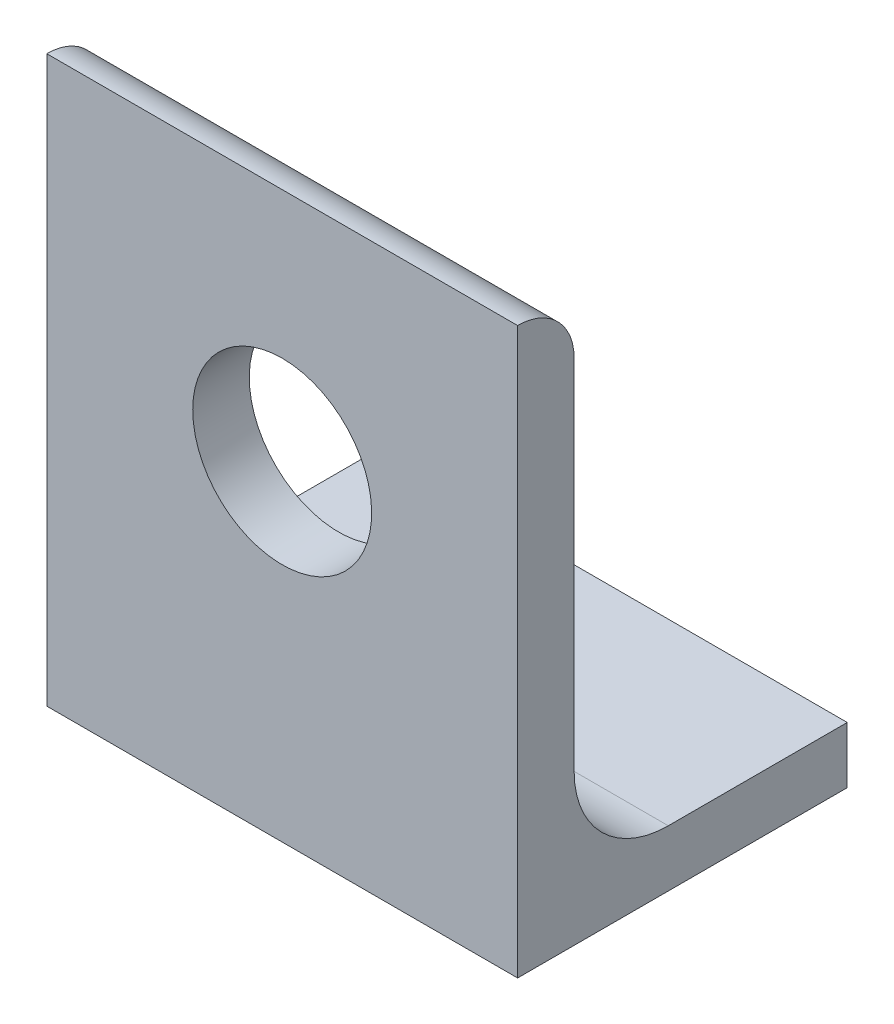
ISO-10303-21;
HEADER;
FILE_DESCRIPTION(('STEP AP214'),'2;1');
FILE_NAME('part.step','',(''),(''),'','','');
FILE_SCHEMA(('AUTOMOTIVE_DESIGN { 1 0 10303 214 1 1 1 1 }'));
ENDSEC;
DATA;
#1=APPLICATION_CONTEXT('core data for automotive mechanical design processes');
#2=APPLICATION_PROTOCOL_DEFINITION('international standard','automotive_design',2000,#1);
#3=PRODUCT_CONTEXT('',#1,'mechanical');
#4=PRODUCT('Part','Part','',(#3));
#5=PRODUCT_RELATED_PRODUCT_CATEGORY('part','',(#4));
#6=PRODUCT_DEFINITION_FORMATION('','',#4);
#7=PRODUCT_DEFINITION_CONTEXT('part definition',#1,'design');
#8=PRODUCT_DEFINITION('design','',#6,#7);
#9=PRODUCT_DEFINITION_SHAPE('','',#8);
#10=(LENGTH_UNIT() NAMED_UNIT(*) SI_UNIT(.MILLI.,.METRE.));
#11=(NAMED_UNIT(*) PLANE_ANGLE_UNIT() SI_UNIT($,.RADIAN.));
#12=(NAMED_UNIT(*) SI_UNIT($,.STERADIAN.) SOLID_ANGLE_UNIT());
#13=UNCERTAINTY_MEASURE_WITH_UNIT(LENGTH_MEASURE(1.E-05),#10,'distance_accuracy_value','');
#14=(GEOMETRIC_REPRESENTATION_CONTEXT(3) GLOBAL_UNCERTAINTY_ASSIGNED_CONTEXT((#13)) GLOBAL_UNIT_ASSIGNED_CONTEXT((#10,
#11,#12)) REPRESENTATION_CONTEXT('',''));
#15=CARTESIAN_POINT('',(0.,0.,0.));
#16=DIRECTION('',(0.,0.,1.));
#17=DIRECTION('',(1.,0.,0.));
#18=AXIS2_PLACEMENT_3D('',#15,#16,#17);
#19=CARTESIAN_POINT('',(0.,0.,-30.));
#20=DIRECTION('',(0.,1.,0.));
#21=DIRECTION('',(0.,0.,1.));
#22=AXIS2_PLACEMENT_3D('',#19,#20,#21);
#23=PLANE('',#22);
#24=DIRECTION('',(0.,0.,-1.));
#25=VECTOR('',#24,1.);
#26=CARTESIAN_POINT('',(-25.,0.,-30.));
#27=LINE('',#26,#25);
#28=CARTESIAN_POINT('',(-25.,0.,0.));
#29=VERTEX_POINT('',#28);
#30=CARTESIAN_POINT('',(-25.,0.,-17.5));
#31=VERTEX_POINT('',#30);
#32=EDGE_CURVE('E150',#29,#31,#27,.T.);
#33=ORIENTED_EDGE('',*,*,#32,.T.);
#34=DIRECTION('',(-1.,0.,0.));
#35=VECTOR('',#34,1.);
#36=CARTESIAN_POINT('',(-25.,0.,-17.5));
#37=LINE('',#36,#35);
#38=CARTESIAN_POINT('',(0.,0.,-17.5));
#39=VERTEX_POINT('',#38);
#40=EDGE_CURVE('E75',#39,#31,#37,.T.);
#41=ORIENTED_EDGE('',*,*,#40,.F.);
#42=DIRECTION('',(0.,0.,-1.));
#43=VECTOR('',#42,1.);
#44=CARTESIAN_POINT('',(0.,0.,-30.));
#45=LINE('',#44,#43);
#46=CARTESIAN_POINT('',(0.,0.,0.));
#47=VERTEX_POINT('',#46);
#48=EDGE_CURVE('E162',#47,#39,#45,.T.);
#49=ORIENTED_EDGE('',*,*,#48,.F.);
#50=DIRECTION('',(-1.,0.,0.));
#51=VECTOR('',#50,1.);
#52=CARTESIAN_POINT('',(0.,0.,0.));
#53=LINE('',#52,#51);
#54=EDGE_CURVE('E146',#47,#29,#53,.T.);
#55=ORIENTED_EDGE('',*,*,#54,.T.);
#56=EDGE_LOOP('',(#33,#41,#49,#55));
#57=FACE_BOUND('',#56,.T.);
#58=ADVANCED_FACE('F61',(#57),#23,.F.);
#59=CARTESIAN_POINT('',(0.,3.,-8.));
#60=DIRECTION('',(0.,-1.,0.));
#61=DIRECTION('',(0.,0.,-1.));
#62=AXIS2_PLACEMENT_3D('',#59,#60,#61);
#63=PLANE('',#62);
#64=DIRECTION('',(0.,0.,1.));
#65=VECTOR('',#64,1.);
#66=CARTESIAN_POINT('',(0.,3.,-8.));
#67=LINE('',#66,#65);
#68=CARTESIAN_POINT('',(0.,3.,-17.5));
#69=VERTEX_POINT('',#68);
#70=CARTESIAN_POINT('',(0.,3.,-8.));
#71=VERTEX_POINT('',#70);
#72=EDGE_CURVE('E116',#69,#71,#67,.T.);
#73=ORIENTED_EDGE('',*,*,#72,.F.);
#74=DIRECTION('',(1.,0.,0.));
#75=VECTOR('',#74,1.);
#76=CARTESIAN_POINT('',(-25.,3.,-17.5));
#77=LINE('',#76,#75);
#78=CARTESIAN_POINT('',(-25.,3.,-17.5));
#79=VERTEX_POINT('',#78);
#80=EDGE_CURVE('E186',#79,#69,#77,.T.);
#81=ORIENTED_EDGE('',*,*,#80,.F.);
#82=DIRECTION('',(0.,0.,1.));
#83=VECTOR('',#82,1.);
#84=CARTESIAN_POINT('',(-25.,3.,-8.));
#85=LINE('',#84,#83);
#86=CARTESIAN_POINT('',(-25.,3.,-8.));
#87=VERTEX_POINT('',#86);
#88=EDGE_CURVE('E153',#79,#87,#85,.T.);
#89=ORIENTED_EDGE('',*,*,#88,.T.);
#90=DIRECTION('',(-1.,0.,0.));
#91=VECTOR('',#90,1.);
#92=CARTESIAN_POINT('',(0.,3.,-8.));
#93=LINE('',#92,#91);
#94=EDGE_CURVE('E13',#71,#87,#93,.T.);
#95=ORIENTED_EDGE('',*,*,#94,.F.);
#96=EDGE_LOOP('',(#73,#81,#89,#95));
#97=FACE_BOUND('',#96,.T.);
#98=ADVANCED_FACE('F193',(#97),#63,.F.);
#99=CARTESIAN_POINT('',(0.,8.,-8.));
#100=DIRECTION('',(-1.,0.,0.));
#101=DIRECTION('',(0.,0.,1.));
#102=AXIS2_PLACEMENT_3D('',#99,#100,#101);
#103=CYLINDRICAL_SURFACE('',#102,5.);
#104=CARTESIAN_POINT('',(-25.,8.,-8.));
#105=DIRECTION('',(-1.,0.,0.));
#106=DIRECTION('',(0.,0.,1.));
#107=AXIS2_PLACEMENT_3D('',#104,#105,#106);
#108=CIRCLE('',#107,5.);
#109=CARTESIAN_POINT('',(-25.,8.,-3.));
#110=VERTEX_POINT('',#109);
#111=EDGE_CURVE('E156',#87,#110,#108,.T.);
#112=ORIENTED_EDGE('',*,*,#111,.T.);
#113=DIRECTION('',(-1.,0.,0.));
#114=VECTOR('',#113,1.);
#115=CARTESIAN_POINT('',(0.,8.,-3.));
#116=LINE('',#115,#114);
#117=CARTESIAN_POINT('',(0.,8.,-3.));
#118=VERTEX_POINT('',#117);
#119=EDGE_CURVE('E68',#118,#110,#116,.T.);
#120=ORIENTED_EDGE('',*,*,#119,.F.);
#121=CARTESIAN_POINT('',(0.,8.,-8.));
#122=DIRECTION('',(-1.,0.,0.));
#123=DIRECTION('',(0.,0.,1.));
#124=AXIS2_PLACEMENT_3D('',#121,#122,#123);
#125=CIRCLE('',#124,5.);
#126=EDGE_CURVE('E130',#71,#118,#125,.T.);
#127=ORIENTED_EDGE('',*,*,#126,.F.);
#128=ORIENTED_EDGE('',*,*,#94,.T.);
#129=EDGE_LOOP('',(#112,#120,#127,#128));
#130=FACE_BOUND('',#129,.T.);
#131=ADVANCED_FACE('F194',(#130),#103,.F.);
#132=CARTESIAN_POINT('',(0.,27.,-3.));
#133=DIRECTION('',(0.,0.,1.));
#134=DIRECTION('',(0.,-1.,0.));
#135=AXIS2_PLACEMENT_3D('',#132,#133,#134);
#136=PLANE('',#135);
#137=CARTESIAN_POINT('',(-12.5,17.5,-3.));
#138=DIRECTION('',(0.,0.,-1.));
#139=DIRECTION('',(0.,1.,0.));
#140=AXIS2_PLACEMENT_3D('',#137,#138,#139);
#141=CIRCLE('',#140,4.75);
#142=CARTESIAN_POINT('',(-12.5,22.25,-3.));
#143=VERTEX_POINT('',#142);
#144=EDGE_CURVE('E178',#143,#143,#141,.T.);
#145=ORIENTED_EDGE('',*,*,#144,.F.);
#146=EDGE_LOOP('',(#145));
#147=FACE_BOUND('',#146,.T.);
#148=DIRECTION('',(0.,1.,0.));
#149=VECTOR('',#148,1.);
#150=CARTESIAN_POINT('',(-25.,27.,-3.));
#151=LINE('',#150,#149);
#152=CARTESIAN_POINT('',(-25.,27.,-3.));
#153=VERTEX_POINT('',#152);
#154=EDGE_CURVE('E139',#110,#153,#151,.T.);
#155=ORIENTED_EDGE('',*,*,#154,.T.);
#156=DIRECTION('',(-1.,0.,0.));
#157=VECTOR('',#156,1.);
#158=CARTESIAN_POINT('',(0.,27.,-3.));
#159=LINE('',#158,#157);
#160=CARTESIAN_POINT('',(0.,27.,-3.));
#161=VERTEX_POINT('',#160);
#162=EDGE_CURVE('E136',#161,#153,#159,.T.);
#163=ORIENTED_EDGE('',*,*,#162,.F.);
#164=DIRECTION('',(0.,1.,0.));
#165=VECTOR('',#164,1.);
#166=CARTESIAN_POINT('',(0.,27.,-3.));
#167=LINE('',#166,#165);
#168=EDGE_CURVE('E123',#118,#161,#167,.T.);
#169=ORIENTED_EDGE('',*,*,#168,.F.);
#170=ORIENTED_EDGE('',*,*,#119,.T.);
#171=EDGE_LOOP('',(#155,#163,#169,#170));
#172=FACE_BOUND('',#171,.T.);
#173=ADVANCED_FACE('F137',(#147,#172),#136,.F.);
#174=CARTESIAN_POINT('',(0.,27.,0.));
#175=DIRECTION('',(-1.,0.,0.));
#176=DIRECTION('',(0.,0.,1.));
#177=AXIS2_PLACEMENT_3D('',#174,#175,#176);
#178=CYLINDRICAL_SURFACE('',#177,3.);
#179=CARTESIAN_POINT('',(-25.,27.,0.));
#180=DIRECTION('',(1.,0.,0.));
#181=DIRECTION('',(0.,0.,-1.));
#182=AXIS2_PLACEMENT_3D('',#179,#180,#181);
#183=CIRCLE('',#182,3.);
#184=CARTESIAN_POINT('',(-25.,30.,0.));
#185=VERTEX_POINT('',#184);
#186=EDGE_CURVE('E159',#153,#185,#183,.T.);
#187=ORIENTED_EDGE('',*,*,#186,.T.);
#188=DIRECTION('',(-1.,0.,0.));
#189=VECTOR('',#188,1.);
#190=CARTESIAN_POINT('',(0.,30.,0.));
#191=LINE('',#190,#189);
#192=CARTESIAN_POINT('',(0.,30.,0.));
#193=VERTEX_POINT('',#192);
#194=EDGE_CURVE('E142',#193,#185,#191,.T.);
#195=ORIENTED_EDGE('',*,*,#194,.F.);
#196=CARTESIAN_POINT('',(0.,27.,0.));
#197=DIRECTION('',(1.,0.,0.));
#198=DIRECTION('',(0.,0.,-1.));
#199=AXIS2_PLACEMENT_3D('',#196,#197,#198);
#200=CIRCLE('',#199,3.);
#201=EDGE_CURVE('E127',#161,#193,#200,.T.);
#202=ORIENTED_EDGE('',*,*,#201,.F.);
#203=ORIENTED_EDGE('',*,*,#162,.T.);
#204=EDGE_LOOP('',(#187,#195,#202,#203));
#205=FACE_BOUND('',#204,.T.);
#206=ADVANCED_FACE('F144',(#205),#178,.T.);
#207=CARTESIAN_POINT('',(0.,30.,0.));
#208=DIRECTION('',(0.,0.,-1.));
#209=DIRECTION('',(-1.,0.,0.));
#210=AXIS2_PLACEMENT_3D('',#207,#208,#209);
#211=PLANE('',#210);
#212=CARTESIAN_POINT('',(-12.5,17.5,0.));
#213=DIRECTION('',(0.,0.,-1.));
#214=DIRECTION('',(-1.,0.,0.));
#215=AXIS2_PLACEMENT_3D('',#212,#213,#214);
#216=CIRCLE('',#215,4.75);
#217=CARTESIAN_POINT('',(-17.25,17.5,0.));
#218=VERTEX_POINT('',#217);
#219=EDGE_CURVE('E154',#218,#218,#216,.T.);
#220=ORIENTED_EDGE('',*,*,#219,.T.);
#221=EDGE_LOOP('',(#220));
#222=FACE_BOUND('',#221,.T.);
#223=DIRECTION('',(0.,-1.,0.));
#224=VECTOR('',#223,1.);
#225=CARTESIAN_POINT('',(-25.,30.,0.));
#226=LINE('',#225,#224);
#227=EDGE_CURVE('E108',#185,#29,#226,.T.);
#228=ORIENTED_EDGE('',*,*,#227,.T.);
#229=ORIENTED_EDGE('',*,*,#54,.F.);
#230=DIRECTION('',(0.,-1.,0.));
#231=VECTOR('',#230,1.);
#232=CARTESIAN_POINT('',(0.,30.,0.));
#233=LINE('',#232,#231);
#234=EDGE_CURVE('E84',#193,#47,#233,.T.);
#235=ORIENTED_EDGE('',*,*,#234,.F.);
#236=ORIENTED_EDGE('',*,*,#194,.T.);
#237=EDGE_LOOP('',(#228,#229,#235,#236));
#238=FACE_BOUND('',#237,.T.);
#239=ADVANCED_FACE('F170',(#222,#238),#211,.F.);
#240=CARTESIAN_POINT('',(0.,27.,0.));
#241=DIRECTION('',(1.,0.,0.));
#242=DIRECTION('',(0.,0.,-1.));
#243=AXIS2_PLACEMENT_3D('',#240,#241,#242);
#244=PLANE('',#243);
#245=DIRECTION('',(0.,-1.,0.));
#246=VECTOR('',#245,1.);
#247=CARTESIAN_POINT('',(0.,30.001,-17.5));
#248=LINE('',#247,#246);
#249=EDGE_CURVE('E182',#69,#39,#248,.T.);
#250=ORIENTED_EDGE('',*,*,#249,.F.);
#251=ORIENTED_EDGE('',*,*,#72,.T.);
#252=ORIENTED_EDGE('',*,*,#126,.T.);
#253=ORIENTED_EDGE('',*,*,#168,.T.);
#254=ORIENTED_EDGE('',*,*,#201,.T.);
#255=ORIENTED_EDGE('',*,*,#234,.T.);
#256=ORIENTED_EDGE('',*,*,#48,.T.);
#257=EDGE_LOOP('',(#250,#251,#252,#253,#254,#255,#256));
#258=FACE_BOUND('',#257,.T.);
#259=ADVANCED_FACE('F125',(#258),#244,.T.);
#260=CARTESIAN_POINT('',(-25.,27.,0.));
#261=DIRECTION('',(1.,0.,0.));
#262=DIRECTION('',(0.,0.,-1.));
#263=AXIS2_PLACEMENT_3D('',#260,#261,#262);
#264=PLANE('',#263);
#265=ORIENTED_EDGE('',*,*,#88,.F.);
#266=DIRECTION('',(0.,-1.,0.));
#267=VECTOR('',#266,1.);
#268=CARTESIAN_POINT('',(-25.,30.001,-17.5));
#269=LINE('',#268,#267);
#270=EDGE_CURVE('E181',#79,#31,#269,.T.);
#271=ORIENTED_EDGE('',*,*,#270,.T.);
#272=ORIENTED_EDGE('',*,*,#32,.F.);
#273=ORIENTED_EDGE('',*,*,#227,.F.);
#274=ORIENTED_EDGE('',*,*,#186,.F.);
#275=ORIENTED_EDGE('',*,*,#154,.F.);
#276=ORIENTED_EDGE('',*,*,#111,.F.);
#277=EDGE_LOOP('',(#265,#271,#272,#273,#274,#275,#276));
#278=FACE_BOUND('',#277,.T.);
#279=ADVANCED_FACE('F168',(#278),#264,.F.);
#280=CARTESIAN_POINT('',(-12.5,17.5,-3.));
#281=DIRECTION('',(0.,0.,-1.));
#282=DIRECTION('',(0.,1.,0.));
#283=AXIS2_PLACEMENT_3D('',#280,#281,#282);
#284=CYLINDRICAL_SURFACE('',#283,4.75);
#285=ORIENTED_EDGE('',*,*,#144,.T.);
#286=EDGE_LOOP('',(#285));
#287=FACE_BOUND('',#286,.T.);
#288=ORIENTED_EDGE('',*,*,#219,.F.);
#289=EDGE_LOOP('',(#288));
#290=FACE_BOUND('',#289,.T.);
#291=ADVANCED_FACE('F233',(#287,#290),#284,.F.);
#292=CARTESIAN_POINT('',(-25.,30.001,-17.5));
#293=DIRECTION('',(0.,0.,1.));
#294=DIRECTION('',(1.,0.,0.));
#295=AXIS2_PLACEMENT_3D('',#292,#293,#294);
#296=PLANE('',#295);
#297=ORIENTED_EDGE('',*,*,#80,.T.);
#298=ORIENTED_EDGE('',*,*,#249,.T.);
#299=ORIENTED_EDGE('',*,*,#40,.T.);
#300=ORIENTED_EDGE('',*,*,#270,.F.);
#301=EDGE_LOOP('',(#297,#298,#299,#300));
#302=FACE_BOUND('',#301,.T.);
#303=ADVANCED_FACE('F190',(#302),#296,.F.);
#304=CLOSED_SHELL('',(#58,#98,#131,#173,#206,#239,#259,#279,#291,#303));
#305=MANIFOLD_SOLID_BREP('B2',#304);
#306=ADVANCED_BREP_SHAPE_REPRESENTATION('',(#18,#305),#14);
#307=SHAPE_DEFINITION_REPRESENTATION(#9,#306);
ENDSEC;
END-ISO-10303-21;
